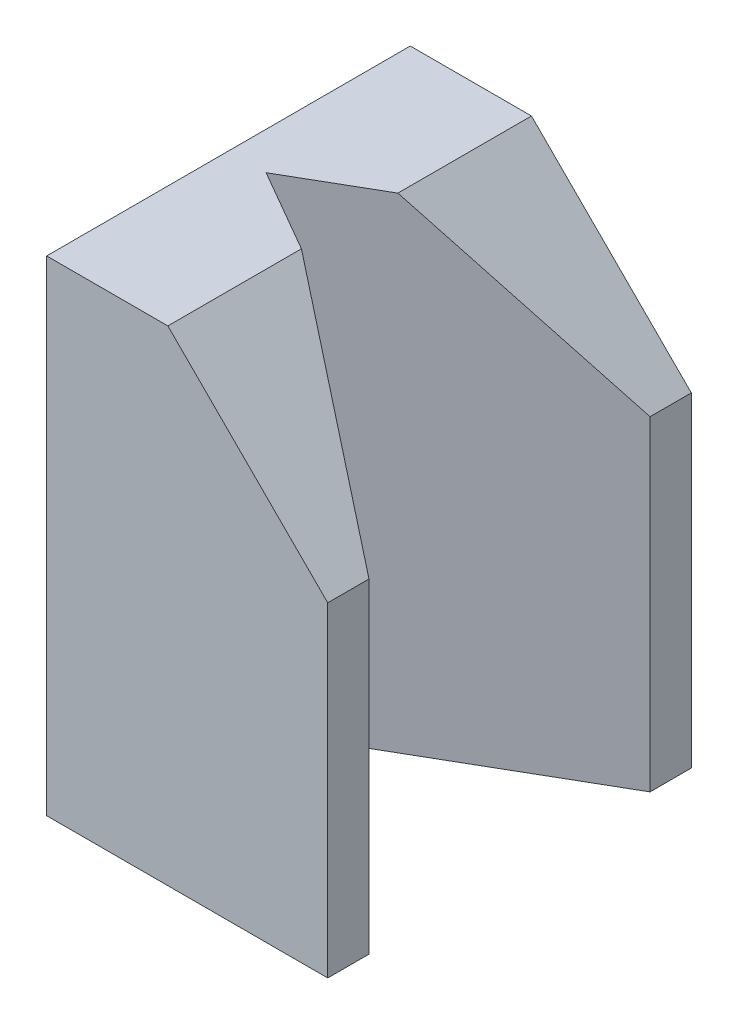
ISO-10303-21;
HEADER;
FILE_DESCRIPTION(('STEP AP214'),'2;1');
FILE_NAME('part.step','',(''),(''),'','','');
FILE_SCHEMA(('AUTOMOTIVE_DESIGN { 1 0 10303 214 1 1 1 1 }'));
ENDSEC;
DATA;
#1=APPLICATION_CONTEXT('core data for automotive mechanical design processes');
#2=APPLICATION_PROTOCOL_DEFINITION('international standard','automotive_design',2000,#1);
#3=PRODUCT_CONTEXT('',#1,'mechanical');
#4=PRODUCT('Part','Part','',(#3));
#5=PRODUCT_RELATED_PRODUCT_CATEGORY('part','',(#4));
#6=PRODUCT_DEFINITION_FORMATION('','',#4);
#7=PRODUCT_DEFINITION_CONTEXT('part definition',#1,'design');
#8=PRODUCT_DEFINITION('design','',#6,#7);
#9=PRODUCT_DEFINITION_SHAPE('','',#8);
#10=(LENGTH_UNIT() NAMED_UNIT(*) SI_UNIT(.MILLI.,.METRE.));
#11=(NAMED_UNIT(*) PLANE_ANGLE_UNIT() SI_UNIT($,.RADIAN.));
#12=(NAMED_UNIT(*) SI_UNIT($,.STERADIAN.) SOLID_ANGLE_UNIT());
#13=UNCERTAINTY_MEASURE_WITH_UNIT(LENGTH_MEASURE(1.E-05),#10,'distance_accuracy_value','');
#14=(GEOMETRIC_REPRESENTATION_CONTEXT(3) GLOBAL_UNCERTAINTY_ASSIGNED_CONTEXT((#13)) GLOBAL_UNIT_ASSIGNED_CONTEXT((#10,
#11,#12)) REPRESENTATION_CONTEXT('',''));
#15=CARTESIAN_POINT('',(0.,0.,0.));
#16=DIRECTION('',(0.,0.,1.));
#17=DIRECTION('',(1.,0.,0.));
#18=AXIS2_PLACEMENT_3D('',#15,#16,#17);
#19=CARTESIAN_POINT('',(44.1775343783056,76.2,-15.8353404804023));
#20=DIRECTION('',(-1.,0.,0.));
#21=DIRECTION('',(0.,0.,1.));
#22=AXIS2_PLACEMENT_3D('',#19,#20,#21);
#23=PLANE('',#22);
#24=DIRECTION('',(0.,0.,-1.));
#25=VECTOR('',#24,1.);
#26=CARTESIAN_POINT('',(44.1775343783056,51.0724656216945,159.147306077426));
#27=LINE('',#26,#25);
#28=CARTESIAN_POINT('',(44.1775343783056,51.0724656216945,-15.8353404804023));
#29=VERTEX_POINT('',#28);
#30=CARTESIAN_POINT('',(44.1775343783056,51.0724656216945,-22.3215732912496));
#31=VERTEX_POINT('',#30);
#32=EDGE_CURVE('E173',#29,#31,#27,.T.);
#33=ORIENTED_EDGE('',*,*,#32,.F.);
#34=DIRECTION('',(0.,-1.,0.));
#35=VECTOR('',#34,1.);
#36=CARTESIAN_POINT('',(44.1775343783056,76.2,-15.8353404804023));
#37=LINE('',#36,#35);
#38=CARTESIAN_POINT('',(44.1775343783056,0.,-15.8353404804023));
#39=VERTEX_POINT('',#38);
#40=EDGE_CURVE('E129',#29,#39,#37,.T.);
#41=ORIENTED_EDGE('',*,*,#40,.T.);
#42=DIRECTION('',(0.,0.,-1.));
#43=VECTOR('',#42,1.);
#44=CARTESIAN_POINT('',(44.1775343783056,0.,-15.8353404804023));
#45=LINE('',#44,#43);
#46=CARTESIAN_POINT('',(44.1775343783056,0.,-22.3215732912496));
#47=VERTEX_POINT('',#46);
#48=EDGE_CURVE('E130',#39,#47,#45,.T.);
#49=ORIENTED_EDGE('',*,*,#48,.T.);
#50=DIRECTION('',(0.,-1.,0.));
#51=VECTOR('',#50,1.);
#52=CARTESIAN_POINT('',(44.1775343783056,76.2,-22.3215732912496));
#53=LINE('',#52,#51);
#54=EDGE_CURVE('E158',#31,#47,#53,.T.);
#55=ORIENTED_EDGE('',*,*,#54,.F.);
#56=EDGE_LOOP('',(#33,#41,#49,#55));
#57=FACE_BOUND('',#56,.T.);
#58=ADVANCED_FACE('F33',(#57),#23,.F.);
#59=CARTESIAN_POINT('',(44.1775343783056,76.2,-22.3215732912496));
#60=DIRECTION('',(0.,0.,1.));
#61=DIRECTION('',(1.,0.,0.));
#62=AXIS2_PLACEMENT_3D('',#59,#60,#61);
#63=PLANE('',#62);
#64=DIRECTION('',(-0.707106781186549,0.707106781186546,0.));
#65=VECTOR('',#64,1.);
#66=CARTESIAN_POINT('',(31.6137671891529,63.6362328108472,-22.3215732912496));
#67=LINE('',#66,#65);
#68=CARTESIAN_POINT('',(19.05,76.2,-22.3215732912496));
#69=VERTEX_POINT('',#68);
#70=EDGE_CURVE('E54',#31,#69,#67,.T.);
#71=ORIENTED_EDGE('',*,*,#70,.F.);
#72=ORIENTED_EDGE('',*,*,#54,.T.);
#73=DIRECTION('',(-1.,0.,0.));
#74=VECTOR('',#73,1.);
#75=CARTESIAN_POINT('',(44.1775343783056,0.,-22.3215732912496));
#76=LINE('',#75,#74);
#77=CARTESIAN_POINT('',(0.,0.,-22.3215732912496));
#78=VERTEX_POINT('',#77);
#79=EDGE_CURVE('E133',#47,#78,#76,.T.);
#80=ORIENTED_EDGE('',*,*,#79,.T.);
#81=DIRECTION('',(0.,-1.,0.));
#82=VECTOR('',#81,1.);
#83=CARTESIAN_POINT('',(0.,76.2,-22.3215732912496));
#84=LINE('',#83,#82);
#85=CARTESIAN_POINT('',(0.,76.2,-22.3215732912496));
#86=VERTEX_POINT('',#85);
#87=EDGE_CURVE('E156',#86,#78,#84,.T.);
#88=ORIENTED_EDGE('',*,*,#87,.F.);
#89=DIRECTION('',(-1.,0.,0.));
#90=VECTOR('',#89,1.);
#91=CARTESIAN_POINT('',(44.1775343783056,76.2,-22.3215732912496));
#92=LINE('',#91,#90);
#93=EDGE_CURVE('E123',#69,#86,#92,.T.);
#94=ORIENTED_EDGE('',*,*,#93,.F.);
#95=EDGE_LOOP('',(#71,#72,#80,#88,#94));
#96=FACE_BOUND('',#95,.T.);
#97=ADVANCED_FACE('F166',(#96),#63,.F.);
#98=CARTESIAN_POINT('',(0.,76.2,34.8284267087504));
#99=DIRECTION('',(0.,0.,-1.));
#100=DIRECTION('',(-1.,0.,0.));
#101=AXIS2_PLACEMENT_3D('',#98,#99,#100);
#102=PLANE('',#101);
#103=DIRECTION('',(0.707106781186549,-0.707106781186546,0.));
#104=VECTOR('',#103,1.);
#105=CARTESIAN_POINT('',(9.52499999999996,85.725,34.8284267087504));
#106=LINE('',#105,#104);
#107=CARTESIAN_POINT('',(19.05,76.2,34.8284267087504));
#108=VERTEX_POINT('',#107);
#109=CARTESIAN_POINT('',(44.1775343783056,51.0724656216945,34.8284267087504));
#110=VERTEX_POINT('',#109);
#111=EDGE_CURVE('E101',#108,#110,#106,.T.);
#112=ORIENTED_EDGE('',*,*,#111,.F.);
#113=DIRECTION('',(1.,0.,0.));
#114=VECTOR('',#113,1.);
#115=CARTESIAN_POINT('',(0.,76.2,34.8284267087504));
#116=LINE('',#115,#114);
#117=CARTESIAN_POINT('',(0.,76.2,34.8284267087504));
#118=VERTEX_POINT('',#117);
#119=EDGE_CURVE('E111',#118,#108,#116,.T.);
#120=ORIENTED_EDGE('',*,*,#119,.F.);
#121=DIRECTION('',(0.,-1.,0.));
#122=VECTOR('',#121,1.);
#123=CARTESIAN_POINT('',(0.,76.2,34.8284267087504));
#124=LINE('',#123,#122);
#125=CARTESIAN_POINT('',(0.,0.,34.8284267087504));
#126=VERTEX_POINT('',#125);
#127=EDGE_CURVE('E154',#118,#126,#124,.T.);
#128=ORIENTED_EDGE('',*,*,#127,.T.);
#129=DIRECTION('',(1.,0.,0.));
#130=VECTOR('',#129,1.);
#131=CARTESIAN_POINT('',(0.,0.,34.8284267087504));
#132=LINE('',#131,#130);
#133=CARTESIAN_POINT('',(44.1775343783056,0.,34.8284267087504));
#134=VERTEX_POINT('',#133);
#135=EDGE_CURVE('E137',#126,#134,#132,.T.);
#136=ORIENTED_EDGE('',*,*,#135,.T.);
#137=DIRECTION('',(0.,-1.,0.));
#138=VECTOR('',#137,1.);
#139=CARTESIAN_POINT('',(44.1775343783056,76.2,34.8284267087504));
#140=LINE('',#139,#138);
#141=EDGE_CURVE('E113',#110,#134,#140,.T.);
#142=ORIENTED_EDGE('',*,*,#141,.F.);
#143=EDGE_LOOP('',(#112,#120,#128,#136,#142));
#144=FACE_BOUND('',#143,.T.);
#145=ADVANCED_FACE('F109',(#144),#102,.F.);
#146=CARTESIAN_POINT('',(44.1775343783056,76.2,34.8284267087504));
#147=DIRECTION('',(-1.,0.,0.));
#148=DIRECTION('',(0.,0.,1.));
#149=AXIS2_PLACEMENT_3D('',#146,#147,#148);
#150=PLANE('',#149);
#151=CARTESIAN_POINT('',(44.1775343783056,51.0724656216945,28.342193897903));
#152=VERTEX_POINT('',#151);
#153=EDGE_CURVE('E172',#110,#152,#27,.T.);
#154=ORIENTED_EDGE('',*,*,#153,.F.);
#155=ORIENTED_EDGE('',*,*,#141,.T.);
#156=DIRECTION('',(0.,0.,-1.));
#157=VECTOR('',#156,1.);
#158=CARTESIAN_POINT('',(44.1775343783056,0.,34.8284267087504));
#159=LINE('',#158,#157);
#160=CARTESIAN_POINT('',(44.1775343783056,0.,28.342193897903));
#161=VERTEX_POINT('',#160);
#162=EDGE_CURVE('E139',#134,#161,#159,.T.);
#163=ORIENTED_EDGE('',*,*,#162,.T.);
#164=DIRECTION('',(0.,-1.,0.));
#165=VECTOR('',#164,1.);
#166=CARTESIAN_POINT('',(44.1775343783056,76.2,28.342193897903));
#167=LINE('',#166,#165);
#168=EDGE_CURVE('E151',#152,#161,#167,.T.);
#169=ORIENTED_EDGE('',*,*,#168,.F.);
#170=EDGE_LOOP('',(#154,#155,#163,#169));
#171=FACE_BOUND('',#170,.T.);
#172=ADVANCED_FACE('F180',(#171),#150,.F.);
#173=CARTESIAN_POINT('',(44.1775343783056,76.2,28.342193897903));
#174=DIRECTION('',(-0.499999999999995,0.,0.866025403784442));
#175=DIRECTION('',(0.866025403784442,0.,0.499999999999995));
#176=AXIS2_PLACEMENT_3D('',#173,#174,#175);
#177=PLANE('',#176);
#178=DIRECTION('',(-0.65465367070798,0.654653670707977,-0.377964473009224));
#179=VECTOR('',#178,1.);
#180=CARTESIAN_POINT('',(33.4085910733175,61.8414089266826,22.1247415818804));
#181=LINE('',#180,#179);
#182=CARTESIAN_POINT('',(19.05,76.2,13.8348051605169));
#183=VERTEX_POINT('',#182);
#184=EDGE_CURVE('E47',#152,#183,#181,.T.);
#185=ORIENTED_EDGE('',*,*,#184,.F.);
#186=ORIENTED_EDGE('',*,*,#168,.T.);
#187=DIRECTION('',(-0.866025403784442,0.,-0.499999999999995));
#188=VECTOR('',#187,1.);
#189=CARTESIAN_POINT('',(44.1775343783056,0.,28.342193897903));
#190=LINE('',#189,#188);
#191=CARTESIAN_POINT('',(5.9186673301326,0.,6.25342670875054));
#192=VERTEX_POINT('',#191);
#193=EDGE_CURVE('E142',#161,#192,#190,.T.);
#194=ORIENTED_EDGE('',*,*,#193,.T.);
#195=DIRECTION('',(0.,-1.,0.));
#196=VECTOR('',#195,1.);
#197=CARTESIAN_POINT('',(5.9186673301326,76.2,6.25342670875054));
#198=LINE('',#197,#196);
#199=CARTESIAN_POINT('',(5.9186673301326,76.2,6.25342670875054));
#200=VERTEX_POINT('',#199);
#201=EDGE_CURVE('E148',#200,#192,#198,.T.);
#202=ORIENTED_EDGE('',*,*,#201,.F.);
#203=DIRECTION('',(-0.866025403784442,0.,-0.499999999999995));
#204=VECTOR('',#203,1.);
#205=CARTESIAN_POINT('',(44.1775343783056,76.2,28.342193897903));
#206=LINE('',#205,#204);
#207=EDGE_CURVE('E119',#183,#200,#206,.T.);
#208=ORIENTED_EDGE('',*,*,#207,.F.);
#209=EDGE_LOOP('',(#185,#186,#194,#202,#208));
#210=FACE_BOUND('',#209,.T.);
#211=ADVANCED_FACE('F178',(#210),#177,.F.);
#212=CARTESIAN_POINT('',(5.9186673301326,76.2,6.25342670875054));
#213=DIRECTION('',(-0.500000000000001,0.,-0.866025403784438));
#214=DIRECTION('',(-0.866025403784438,0.,0.500000000000001));
#215=AXIS2_PLACEMENT_3D('',#212,#213,#214);
#216=PLANE('',#215);
#217=DIRECTION('',(0.654653670707978,-0.654653670707975,-0.377964473009229));
#218=VECTOR('',#217,1.);
#219=CARTESIAN_POINT('',(11.5463813315043,83.7036186684957,3.00426451513635));
#220=LINE('',#219,#218);
#221=CARTESIAN_POINT('',(19.05,76.2,-1.32795174301595));
#222=VERTEX_POINT('',#221);
#223=EDGE_CURVE('E170',#222,#29,#220,.T.);
#224=ORIENTED_EDGE('',*,*,#223,.F.);
#225=DIRECTION('',(0.866025403784438,0.,-0.500000000000001));
#226=VECTOR('',#225,1.);
#227=CARTESIAN_POINT('',(5.9186673301326,76.2,6.25342670875054));
#228=LINE('',#227,#226);
#229=EDGE_CURVE('E121',#200,#222,#228,.T.);
#230=ORIENTED_EDGE('',*,*,#229,.F.);
#231=ORIENTED_EDGE('',*,*,#201,.T.);
#232=DIRECTION('',(0.866025403784438,0.,-0.500000000000001));
#233=VECTOR('',#232,1.);
#234=CARTESIAN_POINT('',(5.9186673301326,0.,6.25342670875054));
#235=LINE('',#234,#233);
#236=EDGE_CURVE('E144',#192,#39,#235,.T.);
#237=ORIENTED_EDGE('',*,*,#236,.T.);
#238=ORIENTED_EDGE('',*,*,#40,.F.);
#239=EDGE_LOOP('',(#224,#230,#231,#237,#238));
#240=FACE_BOUND('',#239,.T.);
#241=ADVANCED_FACE('F189',(#240),#216,.F.);
#242=CARTESIAN_POINT('',(0.,76.2,0.));
#243=DIRECTION('',(0.,1.,0.));
#244=DIRECTION('',(0.,0.,1.));
#245=AXIS2_PLACEMENT_3D('',#242,#243,#244);
#246=PLANE('',#245);
#247=ORIENTED_EDGE('',*,*,#119,.T.);
#248=DIRECTION('',(0.,0.,-1.));
#249=VECTOR('',#248,1.);
#250=CARTESIAN_POINT('',(19.05,76.2,0.));
#251=LINE('',#250,#249);
#252=EDGE_CURVE('E11',#108,#183,#251,.T.);
#253=ORIENTED_EDGE('',*,*,#252,.T.);
#254=ORIENTED_EDGE('',*,*,#207,.T.);
#255=ORIENTED_EDGE('',*,*,#229,.T.);
#256=EDGE_CURVE('E36',#222,#69,#251,.T.);
#257=ORIENTED_EDGE('',*,*,#256,.T.);
#258=ORIENTED_EDGE('',*,*,#93,.T.);
#259=DIRECTION('',(0.,0.,1.));
#260=VECTOR('',#259,1.);
#261=CARTESIAN_POINT('',(0.,76.2,-22.3215732912496));
#262=LINE('',#261,#260);
#263=EDGE_CURVE('E117',#86,#118,#262,.T.);
#264=ORIENTED_EDGE('',*,*,#263,.T.);
#265=EDGE_LOOP('',(#247,#253,#254,#255,#257,#258,#264));
#266=FACE_BOUND('',#265,.T.);
#267=ADVANCED_FACE('F115',(#266),#246,.T.);
#268=CARTESIAN_POINT('',(0.,76.2,-22.3215732912496));
#269=DIRECTION('',(1.,0.,0.));
#270=DIRECTION('',(0.,0.,-1.));
#271=AXIS2_PLACEMENT_3D('',#268,#269,#270);
#272=PLANE('',#271);
#273=DIRECTION('',(0.,0.,1.));
#274=VECTOR('',#273,1.);
#275=CARTESIAN_POINT('',(0.,0.,-22.3215732912496));
#276=LINE('',#275,#274);
#277=EDGE_CURVE('E135',#78,#126,#276,.T.);
#278=ORIENTED_EDGE('',*,*,#277,.T.);
#279=ORIENTED_EDGE('',*,*,#127,.F.);
#280=ORIENTED_EDGE('',*,*,#263,.F.);
#281=ORIENTED_EDGE('',*,*,#87,.T.);
#282=EDGE_LOOP('',(#278,#279,#280,#281));
#283=FACE_BOUND('',#282,.T.);
#284=ADVANCED_FACE('F195',(#283),#272,.F.);
#285=CARTESIAN_POINT('',(0.,0.,0.));
#286=DIRECTION('',(0.,1.,0.));
#287=DIRECTION('',(0.,0.,1.));
#288=AXIS2_PLACEMENT_3D('',#285,#286,#287);
#289=PLANE('',#288);
#290=ORIENTED_EDGE('',*,*,#48,.F.);
#291=ORIENTED_EDGE('',*,*,#236,.F.);
#292=ORIENTED_EDGE('',*,*,#193,.F.);
#293=ORIENTED_EDGE('',*,*,#162,.F.);
#294=ORIENTED_EDGE('',*,*,#135,.F.);
#295=ORIENTED_EDGE('',*,*,#277,.F.);
#296=ORIENTED_EDGE('',*,*,#79,.F.);
#297=EDGE_LOOP('',(#290,#291,#292,#293,#294,#295,#296));
#298=FACE_BOUND('',#297,.T.);
#299=ADVANCED_FACE('F187',(#298),#289,.F.);
#300=CARTESIAN_POINT('',(19.05,76.2,159.147306077426));
#301=DIRECTION('',(0.707106781186546,0.707106781186549,0.));
#302=DIRECTION('',(-0.707106781186549,0.707106781186546,0.));
#303=AXIS2_PLACEMENT_3D('',#300,#301,#302);
#304=PLANE('',#303);
#305=ORIENTED_EDGE('',*,*,#32,.T.);
#306=ORIENTED_EDGE('',*,*,#70,.T.);
#307=ORIENTED_EDGE('',*,*,#256,.F.);
#308=ORIENTED_EDGE('',*,*,#223,.T.);
#309=EDGE_LOOP('',(#305,#306,#307,#308));
#310=FACE_BOUND('',#309,.T.);
#311=ADVANCED_FACE('F191',(#310),#304,.T.);
#312=ORIENTED_EDGE('',*,*,#252,.F.);
#313=ORIENTED_EDGE('',*,*,#111,.T.);
#314=ORIENTED_EDGE('',*,*,#153,.T.);
#315=ORIENTED_EDGE('',*,*,#184,.T.);
#316=EDGE_LOOP('',(#312,#313,#314,#315));
#317=FACE_BOUND('',#316,.T.);
#318=ADVANCED_FACE('F100',(#317),#304,.T.);
#319=CLOSED_SHELL('',(#58,#97,#145,#172,#211,#241,#267,#284,#299,#311,#318));
#320=MANIFOLD_SOLID_BREP('B2',#319);
#321=ADVANCED_BREP_SHAPE_REPRESENTATION('',(#18,#320),#14);
#322=SHAPE_DEFINITION_REPRESENTATION(#9,#321);
ENDSEC;
END-ISO-10303-21;
